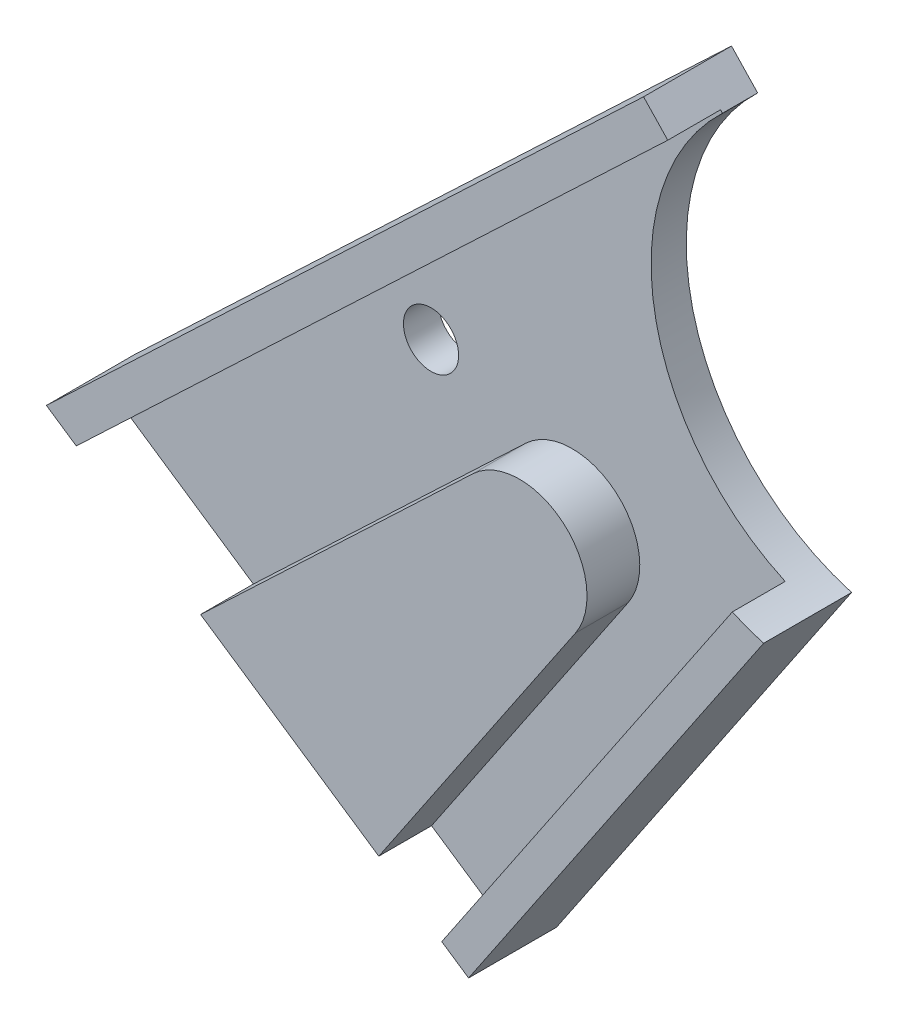
ISO-10303-21;
HEADER;
FILE_DESCRIPTION(('STEP AP214'),'2;1');
FILE_NAME('part.step','',(''),(''),'','','');
FILE_SCHEMA(('AUTOMOTIVE_DESIGN { 1 0 10303 214 1 1 1 1 }'));
ENDSEC;
DATA;
#1=APPLICATION_CONTEXT('core data for automotive mechanical design processes');
#2=APPLICATION_PROTOCOL_DEFINITION('international standard','automotive_design',2000,#1);
#3=PRODUCT_CONTEXT('',#1,'mechanical');
#4=PRODUCT('Part','Part','',(#3));
#5=PRODUCT_RELATED_PRODUCT_CATEGORY('part','',(#4));
#6=PRODUCT_DEFINITION_FORMATION('','',#4);
#7=PRODUCT_DEFINITION_CONTEXT('part definition',#1,'design');
#8=PRODUCT_DEFINITION('design','',#6,#7);
#9=PRODUCT_DEFINITION_SHAPE('','',#8);
#10=(LENGTH_UNIT() NAMED_UNIT(*) SI_UNIT(.MILLI.,.METRE.));
#11=(NAMED_UNIT(*) PLANE_ANGLE_UNIT() SI_UNIT($,.RADIAN.));
#12=(NAMED_UNIT(*) SI_UNIT($,.STERADIAN.) SOLID_ANGLE_UNIT());
#13=UNCERTAINTY_MEASURE_WITH_UNIT(LENGTH_MEASURE(1.E-05),#10,'distance_accuracy_value','');
#14=(GEOMETRIC_REPRESENTATION_CONTEXT(3) GLOBAL_UNCERTAINTY_ASSIGNED_CONTEXT((#13)) GLOBAL_UNIT_ASSIGNED_CONTEXT((#10,
#11,#12)) REPRESENTATION_CONTEXT('',''));
#15=CARTESIAN_POINT('',(0.,0.,0.));
#16=DIRECTION('',(0.,0.,1.));
#17=DIRECTION('',(1.,0.,0.));
#18=AXIS2_PLACEMENT_3D('',#15,#16,#17);
#19=CARTESIAN_POINT('',(0.,0.,1.5875));
#20=DIRECTION('',(0.,0.,1.));
#21=DIRECTION('',(1.,0.,0.));
#22=AXIS2_PLACEMENT_3D('',#19,#20,#21);
#23=PLANE('',#22);
#24=CARTESIAN_POINT('',(464.009536590087,501.284203587237,1.5875));
#25=DIRECTION('',(0.,0.,1.));
#26=DIRECTION('',(1.,0.,0.));
#27=AXIS2_PLACEMENT_3D('',#24,#25,#26);
#28=CIRCLE('',#27,2.48919999999983);
#29=CARTESIAN_POINT('',(466.498736590087,501.284203587237,1.5875));
#30=VERTEX_POINT('',#29);
#31=EDGE_CURVE('E313',#30,#30,#28,.T.);
#32=ORIENTED_EDGE('',*,*,#31,.F.);
#33=EDGE_LOOP('',(#32));
#34=FACE_BOUND('',#33,.T.);
#35=DIRECTION('',(0.687851090308644,-0.725851828930127,0.));
#36=VECTOR('',#35,1.);
#37=CARTESIAN_POINT('',(524.009045454669,496.575442647653,1.5875));
#38=LINE('',#37,#36);
#39=CARTESIAN_POINT('',(490.141330082083,532.314199903743,1.5875));
#40=VERTEX_POINT('',#39);
#41=CARTESIAN_POINT('',(490.316044259021,532.129833539194,1.5875));
#42=VERTEX_POINT('',#41);
#43=EDGE_CURVE('E336',#40,#42,#38,.T.);
#44=ORIENTED_EDGE('',*,*,#43,.F.);
#45=DIRECTION('',(-0.725851828930123,-0.687851090308648,0.));
#46=VECTOR('',#45,1.);
#47=CARTESIAN_POINT('',(-33.8677153725845,35.7387572560866,1.5875));
#48=LINE('',#47,#46);
#49=CARTESIAN_POINT('',(436.753677346008,481.721566972506,1.5875));
#50=VERTEX_POINT('',#49);
#51=EDGE_CURVE('E252',#40,#50,#48,.T.);
#52=ORIENTED_EDGE('',*,*,#51,.T.);
#53=DIRECTION('',(0.829037572555043,-0.559192903470744,0.));
#54=VECTOR('',#53,1.);
#55=CARTESIAN_POINT('',(359.893664703533,533.564300104472,1.5875));
#56=LINE('',#55,#54);
#57=CARTESIAN_POINT('',(447.971192818729,474.155257248344,1.5875));
#58=VERTEX_POINT('',#57);
#59=EDGE_CURVE('E330',#50,#58,#56,.T.);
#60=ORIENTED_EDGE('',*,*,#59,.T.);
#61=DIRECTION('',(0.725851828930123,0.687851090308647,0.));
#62=VECTOR('',#61,1.);
#63=CARTESIAN_POINT('',(-24.7825781717882,26.1517062995779,1.5875));
#64=LINE('',#63,#62);
#65=CARTESIAN_POINT('',(472.563717000126,497.460281631281,1.5875));
#66=VERTEX_POINT('',#65);
#67=EDGE_CURVE('E227',#58,#66,#64,.T.);
#68=ORIENTED_EDGE('',*,*,#67,.T.);
#69=CARTESIAN_POINT('',(476.756857246648,493.035488882123,1.5875));
#70=DIRECTION('',(0.,0.,1.));
#71=DIRECTION('',(1.,0.,0.));
#72=AXIS2_PLACEMENT_3D('',#69,#70,#71);
#73=CIRCLE('',#72,6.0960000000001);
#74=CARTESIAN_POINT('',(481.810670288943,489.626648942565,1.5875));
#75=VERTEX_POINT('',#74);
#76=EDGE_CURVE('E355',#66,#75,#73,.F.);
#77=ORIENTED_EDGE('',*,*,#76,.T.);
#78=DIRECTION('',(0.559192903470747,0.829037572555042,0.));
#79=VECTOR('',#78,1.);
#80=CARTESIAN_POINT('',(104.163100246067,-70.2588982566839,1.5875));
#81=LINE('',#80,#79);
#82=CARTESIAN_POINT('',(464.056764949602,463.305401847788,1.5875));
#83=VERTEX_POINT('',#82);
#84=EDGE_CURVE('E128',#83,#75,#81,.T.);
#85=ORIENTED_EDGE('',*,*,#84,.F.);
#86=CARTESIAN_POINT('',(469.742304622184,459.470456915785,1.5875));
#87=VERTEX_POINT('',#86);
#88=EDGE_CURVE('E308',#83,#87,#56,.T.);
#89=ORIENTED_EDGE('',*,*,#88,.T.);
#90=DIRECTION('',(0.559192903470747,0.829037572555042,0.));
#91=VECTOR('',#90,1.);
#92=CARTESIAN_POINT('',(109.84863991865,-74.0938431886862,1.5875));
#93=LINE('',#92,#91);
#94=CARTESIAN_POINT('',(495.97441001889,498.361152498854,1.5875));
#95=VERTEX_POINT('',#94);
#96=EDGE_CURVE('E12',#87,#95,#93,.T.);
#97=ORIENTED_EDGE('',*,*,#96,.T.);
#98=CARTESIAN_POINT('',(504.511571135266,517.150066419649,1.5875));
#99=DIRECTION('',(0.,0.,1.));
#100=DIRECTION('',(1.,0.,0.));
#101=AXIS2_PLACEMENT_3D('',#98,#99,#100);
#102=CIRCLE('',#101,20.6375);
#103=EDGE_CURVE('E333',#42,#95,#102,.T.);
#104=ORIENTED_EDGE('',*,*,#103,.F.);
#105=EDGE_LOOP('',(#44,#52,#60,#68,#77,#85,#89,#97,#104));
#106=FACE_BOUND('',#105,.T.);
#107=ADVANCED_FACE('F119',(#34,#106),#23,.T.);
#108=CARTESIAN_POINT('',(359.893664703533,533.564300104472,-1.5875));
#109=DIRECTION('',(-0.559192903470744,-0.829037572555043,0.));
#110=DIRECTION('',(0.829037572555043,-0.559192903470744,0.));
#111=AXIS2_PLACEMENT_3D('',#108,#109,#110);
#112=PLANE('',#111);
#113=ORIENTED_EDGE('',*,*,#59,.F.);
#114=DIRECTION('',(0.,0.,-1.));
#115=VECTOR('',#114,1.);
#116=CARTESIAN_POINT('',(436.753677346008,481.721566972506,6.35));
#117=LINE('',#116,#115);
#118=CARTESIAN_POINT('',(436.753677346008,481.721566972506,6.35));
#119=VERTEX_POINT('',#118);
#120=EDGE_CURVE('E233',#119,#50,#117,.T.);
#121=ORIENTED_EDGE('',*,*,#120,.F.);
#122=DIRECTION('',(0.829037572555043,-0.559192903470744,0.));
#123=VECTOR('',#122,1.);
#124=CARTESIAN_POINT('',(359.893664703533,533.564300104472,6.35));
#125=LINE('',#124,#123);
#126=CARTESIAN_POINT('',(434.057159203527,483.54039142543,6.35));
#127=VERTEX_POINT('',#126);
#128=EDGE_CURVE('E231',#127,#119,#125,.T.);
#129=ORIENTED_EDGE('',*,*,#128,.F.);
#130=DIRECTION('',(0.,0.,1.));
#131=VECTOR('',#130,1.);
#132=CARTESIAN_POINT('',(434.057159203527,483.54039142543,-1.5875));
#133=LINE('',#132,#131);
#134=CARTESIAN_POINT('',(434.057159203527,483.54039142543,-1.5875));
#135=VERTEX_POINT('',#134);
#136=EDGE_CURVE('E215',#135,#127,#133,.T.);
#137=ORIENTED_EDGE('',*,*,#136,.F.);
#138=DIRECTION('',(0.829037572555043,-0.559192903470744,0.));
#139=VECTOR('',#138,1.);
#140=CARTESIAN_POINT('',(359.893664703533,533.564300104472,-1.5875));
#141=LINE('',#140,#139);
#142=CARTESIAN_POINT('',(472.163923371617,457.837054444747,-1.5875));
#143=VERTEX_POINT('',#142);
#144=EDGE_CURVE('E309',#135,#143,#141,.T.);
#145=ORIENTED_EDGE('',*,*,#144,.T.);
#146=DIRECTION('',(0.,0.,1.));
#147=VECTOR('',#146,1.);
#148=CARTESIAN_POINT('',(472.163923371617,457.837054444747,-1.5875));
#149=LINE('',#148,#147);
#150=CARTESIAN_POINT('',(472.163923371617,457.837054444747,6.35));
#151=VERTEX_POINT('',#150);
#152=EDGE_CURVE('E329',#143,#151,#149,.T.);
#153=ORIENTED_EDGE('',*,*,#152,.T.);
#154=DIRECTION('',(0.829037572555043,-0.559192903470744,0.));
#155=VECTOR('',#154,1.);
#156=CARTESIAN_POINT('',(359.893664703533,533.564300104472,6.35));
#157=LINE('',#156,#155);
#158=CARTESIAN_POINT('',(469.742304622184,459.470456915785,6.35));
#159=VERTEX_POINT('',#158);
#160=EDGE_CURVE('E263',#159,#151,#157,.T.);
#161=ORIENTED_EDGE('',*,*,#160,.F.);
#162=DIRECTION('',(0.,0.,-1.));
#163=VECTOR('',#162,1.);
#164=CARTESIAN_POINT('',(469.742304622184,459.470456915785,6.35));
#165=LINE('',#164,#163);
#166=EDGE_CURVE('E271',#159,#87,#165,.T.);
#167=ORIENTED_EDGE('',*,*,#166,.T.);
#168=ORIENTED_EDGE('',*,*,#88,.F.);
#169=DIRECTION('',(0.,0.,-1.));
#170=VECTOR('',#169,1.);
#171=CARTESIAN_POINT('',(464.056764949602,463.305401847788,6.35));
#172=LINE('',#171,#170);
#173=CARTESIAN_POINT('',(464.056764949602,463.305401847788,6.35));
#174=VERTEX_POINT('',#173);
#175=EDGE_CURVE('E292',#174,#83,#172,.T.);
#176=ORIENTED_EDGE('',*,*,#175,.F.);
#177=DIRECTION('',(0.829037572555043,-0.559192903470744,0.));
#178=VECTOR('',#177,1.);
#179=CARTESIAN_POINT('',(359.893664703533,533.564300104472,6.35));
#180=LINE('',#179,#178);
#181=CARTESIAN_POINT('',(447.971192818729,474.155257248344,6.35));
#182=VERTEX_POINT('',#181);
#183=EDGE_CURVE('E289',#182,#174,#180,.T.);
#184=ORIENTED_EDGE('',*,*,#183,.F.);
#185=DIRECTION('',(0.,0.,-1.));
#186=VECTOR('',#185,1.);
#187=CARTESIAN_POINT('',(447.971192818729,474.155257248344,6.35));
#188=LINE('',#187,#186);
#189=EDGE_CURVE('E296',#182,#58,#188,.T.);
#190=ORIENTED_EDGE('',*,*,#189,.T.);
#191=EDGE_LOOP('',(#113,#121,#129,#137,#145,#153,#161,#167,#168,#176,#184,#190));
#192=FACE_BOUND('',#191,.T.);
#193=ADVANCED_FACE('F121',(#192),#112,.T.);
#194=CARTESIAN_POINT('',(-36.0516425843144,38.0433368129398,-1.5875));
#195=DIRECTION('',(0.687851090308648,-0.725851828930123,0.));
#196=DIRECTION('',(0.725851828930123,0.687851090308648,0.));
#197=AXIS2_PLACEMENT_3D('',#194,#195,#196);
#198=PLANE('',#197);
#199=DIRECTION('',(0.725851828930123,0.687851090308648,0.));
#200=VECTOR('',#199,1.);
#201=CARTESIAN_POINT('',(-36.0516425843144,38.0433368129398,6.35));
#202=LINE('',#201,#200);
#203=CARTESIAN_POINT('',(487.957402870353,534.618779460596,6.35));
#204=VERTEX_POINT('',#203);
#205=EDGE_CURVE('E220',#127,#204,#202,.T.);
#206=ORIENTED_EDGE('',*,*,#205,.T.);
#207=DIRECTION('',(0.,0.,1.));
#208=VECTOR('',#207,1.);
#209=CARTESIAN_POINT('',(487.957402870353,534.618779460596,-1.5875));
#210=LINE('',#209,#208);
#211=CARTESIAN_POINT('',(487.957402870353,534.618779460596,-1.5875));
#212=VERTEX_POINT('',#211);
#213=EDGE_CURVE('E228',#212,#204,#210,.T.);
#214=ORIENTED_EDGE('',*,*,#213,.F.);
#215=DIRECTION('',(0.725851828930123,0.687851090308648,0.));
#216=VECTOR('',#215,1.);
#217=CARTESIAN_POINT('',(-36.0516425843144,38.0433368129398,-1.5875));
#218=LINE('',#217,#216);
#219=EDGE_CURVE('E222',#135,#212,#218,.T.);
#220=ORIENTED_EDGE('',*,*,#219,.F.);
#221=ORIENTED_EDGE('',*,*,#136,.T.);
#222=EDGE_LOOP('',(#206,#214,#220,#221));
#223=FACE_BOUND('',#222,.T.);
#224=ADVANCED_FACE('F217',(#223),#198,.F.);
#225=CARTESIAN_POINT('',(524.009045454669,496.575442647653,-1.5875));
#226=DIRECTION('',(-0.725851828930126,-0.687851090308644,0.));
#227=DIRECTION('',(0.687851090308644,-0.725851828930127,0.));
#228=AXIS2_PLACEMENT_3D('',#225,#226,#227);
#229=PLANE('',#228);
#230=ORIENTED_EDGE('',*,*,#213,.T.);
#231=DIRECTION('',(0.687851090308644,-0.725851828930127,0.));
#232=VECTOR('',#231,1.);
#233=CARTESIAN_POINT('',(524.009045454669,496.575442647653,6.35));
#234=LINE('',#233,#232);
#235=CARTESIAN_POINT('',(490.141330082083,532.314199903743,6.35));
#236=VERTEX_POINT('',#235);
#237=EDGE_CURVE('E240',#204,#236,#234,.T.);
#238=ORIENTED_EDGE('',*,*,#237,.T.);
#239=DIRECTION('',(0.,0.,-1.));
#240=VECTOR('',#239,1.);
#241=CARTESIAN_POINT('',(490.141330082083,532.314199903743,6.35));
#242=LINE('',#241,#240);
#243=EDGE_CURVE('E135',#236,#40,#242,.T.);
#244=ORIENTED_EDGE('',*,*,#243,.T.);
#245=ORIENTED_EDGE('',*,*,#43,.T.);
#246=DIRECTION('',(0.,0.,1.));
#247=VECTOR('',#246,1.);
#248=CARTESIAN_POINT('',(490.316044259021,532.129833539194,-1.5875));
#249=LINE('',#248,#247);
#250=CARTESIAN_POINT('',(490.316044259021,532.129833539194,-1.5875));
#251=VERTEX_POINT('',#250);
#252=EDGE_CURVE('E344',#251,#42,#249,.T.);
#253=ORIENTED_EDGE('',*,*,#252,.F.);
#254=DIRECTION('',(0.687851090308644,-0.725851828930127,0.));
#255=VECTOR('',#254,1.);
#256=CARTESIAN_POINT('',(524.009045454669,496.575442647653,-1.5875));
#257=LINE('',#256,#255);
#258=EDGE_CURVE('E320',#212,#251,#257,.T.);
#259=ORIENTED_EDGE('',*,*,#258,.F.);
#260=EDGE_LOOP('',(#230,#238,#244,#245,#253,#259));
#261=FACE_BOUND('',#260,.T.);
#262=ADVANCED_FACE('F387',(#261),#229,.F.);
#263=CARTESIAN_POINT('',(504.511571135266,517.150066419649,-1.5875));
#264=DIRECTION('',(0.,0.,1.));
#265=DIRECTION('',(1.,0.,0.));
#266=AXIS2_PLACEMENT_3D('',#263,#264,#265);
#267=CYLINDRICAL_SURFACE('',#266,20.6375);
#268=ORIENTED_EDGE('',*,*,#103,.T.);
#269=DIRECTION('',(0.,0.,-1.));
#270=VECTOR('',#269,1.);
#271=CARTESIAN_POINT('',(495.97441001889,498.361152498854,6.35));
#272=LINE('',#271,#270);
#273=CARTESIAN_POINT('',(495.97441001889,498.361152498854,6.35));
#274=VERTEX_POINT('',#273);
#275=EDGE_CURVE('E275',#274,#95,#272,.T.);
#276=ORIENTED_EDGE('',*,*,#275,.F.);
#277=CARTESIAN_POINT('',(504.511571135266,517.150066419649,6.35));
#278=DIRECTION('',(0.,0.,1.));
#279=DIRECTION('',(1.,0.,0.));
#280=AXIS2_PLACEMENT_3D('',#277,#278,#279);
#281=CIRCLE('',#280,20.6375);
#282=CARTESIAN_POINT('',(498.795485399412,497.319968837681,6.35));
#283=VERTEX_POINT('',#282);
#284=EDGE_CURVE('E256',#274,#283,#281,.T.);
#285=ORIENTED_EDGE('',*,*,#284,.T.);
#286=DIRECTION('',(0.,0.,1.));
#287=VECTOR('',#286,1.);
#288=CARTESIAN_POINT('',(498.795485399412,497.319968837681,-1.5875));
#289=LINE('',#288,#287);
#290=CARTESIAN_POINT('',(498.795485399412,497.319968837681,-1.5875));
#291=VERTEX_POINT('',#290);
#292=EDGE_CURVE('E348',#291,#283,#289,.T.);
#293=ORIENTED_EDGE('',*,*,#292,.F.);
#294=CARTESIAN_POINT('',(504.511571135266,517.150066419649,-1.5875));
#295=DIRECTION('',(0.,0.,1.));
#296=DIRECTION('',(1.,0.,0.));
#297=AXIS2_PLACEMENT_3D('',#294,#295,#296);
#298=CIRCLE('',#297,20.6375);
#299=EDGE_CURVE('E317',#251,#291,#298,.T.);
#300=ORIENTED_EDGE('',*,*,#299,.F.);
#301=ORIENTED_EDGE('',*,*,#252,.T.);
#302=EDGE_LOOP('',(#268,#276,#285,#293,#300,#301));
#303=FACE_BOUND('',#302,.T.);
#304=ADVANCED_FACE('F383',(#303),#267,.F.);
#305=CARTESIAN_POINT('',(112.270258668083,-75.7272456597241,-1.5875));
#306=DIRECTION('',(0.829037572555041,-0.559192903470747,0.));
#307=DIRECTION('',(0.559192903470747,0.829037572555041,0.));
#308=AXIS2_PLACEMENT_3D('',#305,#306,#307);
#309=PLANE('',#308);
#310=DIRECTION('',(0.559192903470747,0.829037572555041,0.));
#311=VECTOR('',#310,1.);
#312=CARTESIAN_POINT('',(112.270258668083,-75.7272456597241,6.35));
#313=LINE('',#312,#311);
#314=EDGE_CURVE('E267',#151,#283,#313,.T.);
#315=ORIENTED_EDGE('',*,*,#314,.F.);
#316=ORIENTED_EDGE('',*,*,#152,.F.);
#317=DIRECTION('',(0.559192903470747,0.829037572555041,0.));
#318=VECTOR('',#317,1.);
#319=CARTESIAN_POINT('',(112.270258668083,-75.7272456597241,-1.5875));
#320=LINE('',#319,#318);
#321=EDGE_CURVE('E312',#143,#291,#320,.T.);
#322=ORIENTED_EDGE('',*,*,#321,.T.);
#323=ORIENTED_EDGE('',*,*,#292,.T.);
#324=EDGE_LOOP('',(#315,#316,#322,#323));
#325=FACE_BOUND('',#324,.T.);
#326=ADVANCED_FACE('F397',(#325),#309,.T.);
#327=CARTESIAN_POINT('',(464.009536590087,501.284203587237,-1.5875));
#328=DIRECTION('',(0.,0.,1.));
#329=DIRECTION('',(1.,0.,0.));
#330=AXIS2_PLACEMENT_3D('',#327,#328,#329);
#331=CYLINDRICAL_SURFACE('',#330,2.48919999999983);
#332=CARTESIAN_POINT('',(464.009536590087,501.284203587237,-1.5875));
#333=DIRECTION('',(0.,0.,1.));
#334=DIRECTION('',(1.,0.,0.));
#335=AXIS2_PLACEMENT_3D('',#332,#333,#334);
#336=CIRCLE('',#335,2.48919999999983);
#337=CARTESIAN_POINT('',(466.498736590087,501.284203587237,-1.5875));
#338=VERTEX_POINT('',#337);
#339=EDGE_CURVE('E325',#338,#338,#336,.T.);
#340=ORIENTED_EDGE('',*,*,#339,.F.);
#341=EDGE_LOOP('',(#340));
#342=FACE_BOUND('',#341,.T.);
#343=ORIENTED_EDGE('',*,*,#31,.T.);
#344=EDGE_LOOP('',(#343));
#345=FACE_BOUND('',#344,.T.);
#346=ADVANCED_FACE('F399',(#342,#345),#331,.F.);
#347=CARTESIAN_POINT('',(0.,0.,-1.5875));
#348=DIRECTION('',(0.,0.,1.));
#349=DIRECTION('',(1.,0.,0.));
#350=AXIS2_PLACEMENT_3D('',#347,#348,#349);
#351=PLANE('',#350);
#352=ORIENTED_EDGE('',*,*,#144,.F.);
#353=ORIENTED_EDGE('',*,*,#219,.T.);
#354=ORIENTED_EDGE('',*,*,#258,.T.);
#355=ORIENTED_EDGE('',*,*,#299,.T.);
#356=ORIENTED_EDGE('',*,*,#321,.F.);
#357=EDGE_LOOP('',(#352,#353,#354,#355,#356));
#358=FACE_BOUND('',#357,.T.);
#359=ORIENTED_EDGE('',*,*,#339,.T.);
#360=EDGE_LOOP('',(#359));
#361=FACE_BOUND('',#360,.T.);
#362=ADVANCED_FACE('F391',(#358,#361),#351,.F.);
#363=CARTESIAN_POINT('',(104.163100246067,-70.2588982566839,6.35));
#364=DIRECTION('',(0.829037572555042,-0.559192903470747,0.));
#365=DIRECTION('',(0.559192903470747,0.829037572555042,0.));
#366=AXIS2_PLACEMENT_3D('',#363,#364,#365);
#367=PLANE('',#366);
#368=ORIENTED_EDGE('',*,*,#175,.T.);
#369=ORIENTED_EDGE('',*,*,#84,.T.);
#370=DIRECTION('',(0.,0.,-1.));
#371=VECTOR('',#370,1.);
#372=CARTESIAN_POINT('',(481.810670288943,489.626648942565,6.35));
#373=LINE('',#372,#371);
#374=CARTESIAN_POINT('',(481.810670288943,489.626648942565,6.35));
#375=VERTEX_POINT('',#374);
#376=EDGE_CURVE('E304',#375,#75,#373,.T.);
#377=ORIENTED_EDGE('',*,*,#376,.F.);
#378=DIRECTION('',(-0.559192903470747,-0.829037572555042,0.));
#379=VECTOR('',#378,1.);
#380=CARTESIAN_POINT('',(104.163100246067,-70.2588982566839,6.35));
#381=LINE('',#380,#379);
#382=EDGE_CURVE('E279',#375,#174,#381,.T.);
#383=ORIENTED_EDGE('',*,*,#382,.T.);
#384=EDGE_LOOP('',(#368,#369,#377,#383));
#385=FACE_BOUND('',#384,.T.);
#386=ADVANCED_FACE('F361',(#385),#367,.T.);
#387=CARTESIAN_POINT('',(476.756857246648,493.035488882123,6.35));
#388=DIRECTION('',(0.,0.,-1.));
#389=DIRECTION('',(-1.,0.,0.));
#390=AXIS2_PLACEMENT_3D('',#387,#388,#389);
#391=CYLINDRICAL_SURFACE('',#390,6.0960000000001);
#392=ORIENTED_EDGE('',*,*,#76,.F.);
#393=DIRECTION('',(0.,0.,-1.));
#394=VECTOR('',#393,1.);
#395=CARTESIAN_POINT('',(472.563717000126,497.460281631281,6.35));
#396=LINE('',#395,#394);
#397=CARTESIAN_POINT('',(472.563717000126,497.460281631281,6.35));
#398=VERTEX_POINT('',#397);
#399=EDGE_CURVE('E300',#398,#66,#396,.T.);
#400=ORIENTED_EDGE('',*,*,#399,.F.);
#401=CARTESIAN_POINT('',(476.756857246648,493.035488882123,6.35));
#402=DIRECTION('',(0.,0.,1.));
#403=DIRECTION('',(1.,0.,0.));
#404=AXIS2_PLACEMENT_3D('',#401,#402,#403);
#405=CIRCLE('',#404,6.0960000000001);
#406=EDGE_CURVE('E283',#375,#398,#405,.T.);
#407=ORIENTED_EDGE('',*,*,#406,.F.);
#408=ORIENTED_EDGE('',*,*,#376,.T.);
#409=EDGE_LOOP('',(#392,#400,#407,#408));
#410=FACE_BOUND('',#409,.T.);
#411=ADVANCED_FACE('F366',(#410),#391,.T.);
#412=CARTESIAN_POINT('',(-24.7825781717882,26.1517062995779,6.35));
#413=DIRECTION('',(0.687851090308647,-0.725851828930123,0.));
#414=DIRECTION('',(0.725851828930123,0.687851090308647,0.));
#415=AXIS2_PLACEMENT_3D('',#412,#413,#414);
#416=PLANE('',#415);
#417=ORIENTED_EDGE('',*,*,#67,.F.);
#418=ORIENTED_EDGE('',*,*,#189,.F.);
#419=DIRECTION('',(-0.725851828930123,-0.687851090308647,0.));
#420=VECTOR('',#419,1.);
#421=CARTESIAN_POINT('',(-24.7825781717882,26.1517062995779,6.35));
#422=LINE('',#421,#420);
#423=EDGE_CURVE('E286',#398,#182,#422,.T.);
#424=ORIENTED_EDGE('',*,*,#423,.F.);
#425=ORIENTED_EDGE('',*,*,#399,.T.);
#426=EDGE_LOOP('',(#417,#418,#424,#425));
#427=FACE_BOUND('',#426,.T.);
#428=ADVANCED_FACE('F457',(#427),#416,.F.);
#429=CARTESIAN_POINT('',(0.,0.,6.35));
#430=DIRECTION('',(0.,0.,1.));
#431=DIRECTION('',(1.,0.,0.));
#432=AXIS2_PLACEMENT_3D('',#429,#430,#431);
#433=PLANE('',#432);
#434=ORIENTED_EDGE('',*,*,#382,.F.);
#435=ORIENTED_EDGE('',*,*,#406,.T.);
#436=ORIENTED_EDGE('',*,*,#423,.T.);
#437=ORIENTED_EDGE('',*,*,#183,.T.);
#438=EDGE_LOOP('',(#434,#435,#436,#437));
#439=FACE_BOUND('',#438,.T.);
#440=ADVANCED_FACE('F371',(#439),#433,.T.);
#441=CARTESIAN_POINT('',(109.84863991865,-74.0938431886862,6.35));
#442=DIRECTION('',(0.829037572555042,-0.559192903470747,0.));
#443=DIRECTION('',(0.559192903470747,0.829037572555042,0.));
#444=AXIS2_PLACEMENT_3D('',#441,#442,#443);
#445=PLANE('',#444);
#446=ORIENTED_EDGE('',*,*,#96,.F.);
#447=ORIENTED_EDGE('',*,*,#166,.F.);
#448=DIRECTION('',(-0.559192903470747,-0.829037572555042,0.));
#449=VECTOR('',#448,1.);
#450=CARTESIAN_POINT('',(109.84863991865,-74.0938431886862,6.35));
#451=LINE('',#450,#449);
#452=EDGE_CURVE('E260',#274,#159,#451,.T.);
#453=ORIENTED_EDGE('',*,*,#452,.F.);
#454=ORIENTED_EDGE('',*,*,#275,.T.);
#455=EDGE_LOOP('',(#446,#447,#453,#454));
#456=FACE_BOUND('',#455,.T.);
#457=ADVANCED_FACE('F379',(#456),#445,.F.);
#458=CARTESIAN_POINT('',(0.,0.,6.35));
#459=DIRECTION('',(0.,0.,1.));
#460=DIRECTION('',(1.,0.,0.));
#461=AXIS2_PLACEMENT_3D('',#458,#459,#460);
#462=PLANE('',#461);
#463=ORIENTED_EDGE('',*,*,#284,.F.);
#464=ORIENTED_EDGE('',*,*,#452,.T.);
#465=ORIENTED_EDGE('',*,*,#160,.T.);
#466=ORIENTED_EDGE('',*,*,#314,.T.);
#467=EDGE_LOOP('',(#463,#464,#465,#466));
#468=FACE_BOUND('',#467,.T.);
#469=ADVANCED_FACE('F396',(#468),#462,.T.);
#470=CARTESIAN_POINT('',(-33.8677153725845,35.7387572560866,6.35));
#471=DIRECTION('',(-0.687851090308648,0.725851828930123,0.));
#472=DIRECTION('',(-0.725851828930123,-0.687851090308648,0.));
#473=AXIS2_PLACEMENT_3D('',#470,#471,#472);
#474=PLANE('',#473);
#475=ORIENTED_EDGE('',*,*,#51,.F.);
#476=ORIENTED_EDGE('',*,*,#243,.F.);
#477=DIRECTION('',(0.725851828930123,0.687851090308648,0.));
#478=VECTOR('',#477,1.);
#479=CARTESIAN_POINT('',(-33.8677153725845,35.7387572560866,6.35));
#480=LINE('',#479,#478);
#481=EDGE_CURVE('E237',#119,#236,#480,.T.);
#482=ORIENTED_EDGE('',*,*,#481,.F.);
#483=ORIENTED_EDGE('',*,*,#120,.T.);
#484=EDGE_LOOP('',(#475,#476,#482,#483));
#485=FACE_BOUND('',#484,.T.);
#486=ADVANCED_FACE('F491',(#485),#474,.F.);
#487=CARTESIAN_POINT('',(0.,0.,6.35));
#488=DIRECTION('',(0.,0.,1.));
#489=DIRECTION('',(1.,0.,0.));
#490=AXIS2_PLACEMENT_3D('',#487,#488,#489);
#491=PLANE('',#490);
#492=ORIENTED_EDGE('',*,*,#205,.F.);
#493=ORIENTED_EDGE('',*,*,#128,.T.);
#494=ORIENTED_EDGE('',*,*,#481,.T.);
#495=ORIENTED_EDGE('',*,*,#237,.F.);
#496=EDGE_LOOP('',(#492,#493,#494,#495));
#497=FACE_BOUND('',#496,.T.);
#498=ADVANCED_FACE('F239',(#497),#491,.T.);
#499=CLOSED_SHELL('',(#107,#193,#224,#262,#304,#326,#346,#362,#386,#411,#428,#440,#457,#469,
#486,#498));
#500=MANIFOLD_SOLID_BREP('B2',#499);
#501=ADVANCED_BREP_SHAPE_REPRESENTATION('',(#18,#500),#14);
#502=SHAPE_DEFINITION_REPRESENTATION(#9,#501);
ENDSEC;
END-ISO-10303-21;
